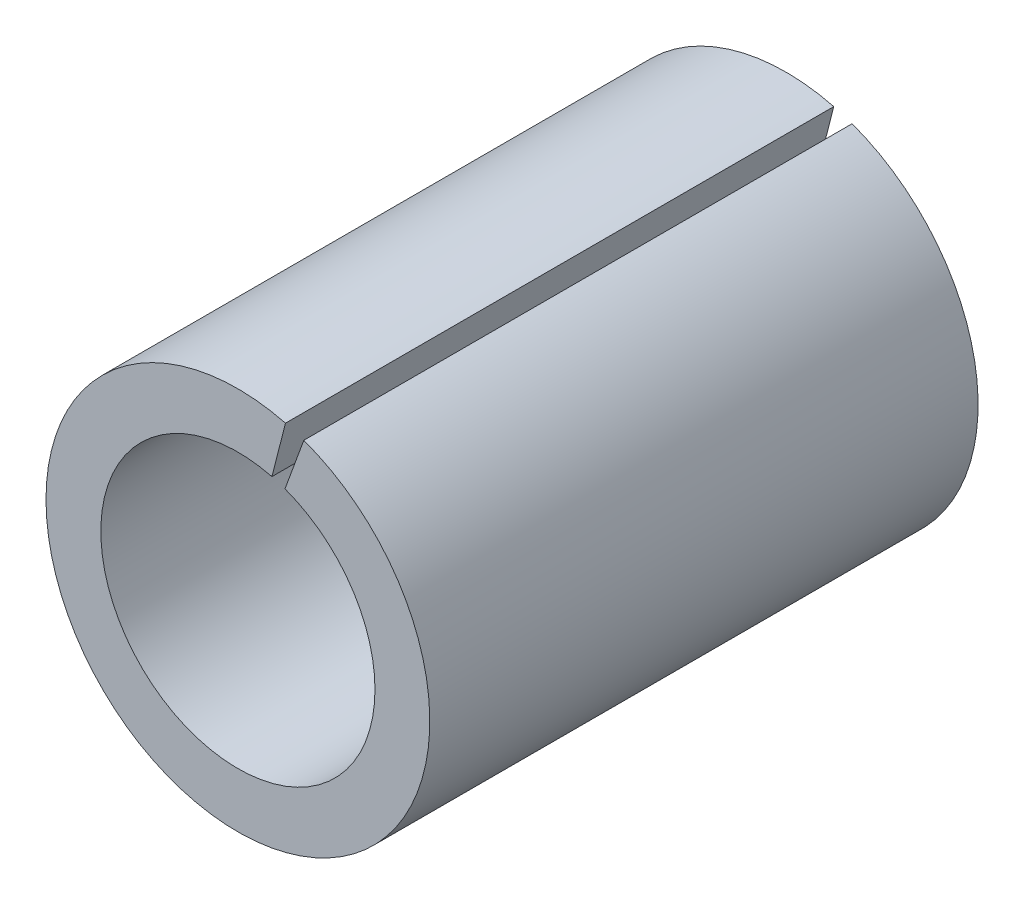
ISO-10303-21;
HEADER;
FILE_DESCRIPTION(('STEP AP214'),'2;1');
FILE_NAME('part.step','',(''),(''),'','','');
FILE_SCHEMA(('AUTOMOTIVE_DESIGN { 1 0 10303 214 1 1 1 1 }'));
ENDSEC;
DATA;
#1=APPLICATION_CONTEXT('core data for automotive mechanical design processes');
#2=APPLICATION_PROTOCOL_DEFINITION('international standard','automotive_design',2000,#1);
#3=PRODUCT_CONTEXT('',#1,'mechanical');
#4=PRODUCT('Part','Part','',(#3));
#5=PRODUCT_RELATED_PRODUCT_CATEGORY('part','',(#4));
#6=PRODUCT_DEFINITION_FORMATION('','',#4);
#7=PRODUCT_DEFINITION_CONTEXT('part definition',#1,'design');
#8=PRODUCT_DEFINITION('design','',#6,#7);
#9=PRODUCT_DEFINITION_SHAPE('','',#8);
#10=(LENGTH_UNIT() NAMED_UNIT(*) SI_UNIT(.MILLI.,.METRE.));
#11=(NAMED_UNIT(*) PLANE_ANGLE_UNIT() SI_UNIT($,.RADIAN.));
#12=(NAMED_UNIT(*) SI_UNIT($,.STERADIAN.) SOLID_ANGLE_UNIT());
#13=UNCERTAINTY_MEASURE_WITH_UNIT(LENGTH_MEASURE(1.E-05),#10,'distance_accuracy_value','');
#14=(GEOMETRIC_REPRESENTATION_CONTEXT(3) GLOBAL_UNCERTAINTY_ASSIGNED_CONTEXT((#13)) GLOBAL_UNIT_ASSIGNED_CONTEXT((#10,
#11,#12)) REPRESENTATION_CONTEXT('',''));
#15=CARTESIAN_POINT('',(0.,0.,0.));
#16=DIRECTION('',(0.,0.,1.));
#17=DIRECTION('',(1.,0.,0.));
#18=AXIS2_PLACEMENT_3D('',#15,#16,#17);
#19=CARTESIAN_POINT('',(0.,0.,10.));
#20=DIRECTION('',(0.,0.,1.));
#21=DIRECTION('',(1.,0.,0.));
#22=AXIS2_PLACEMENT_3D('',#19,#20,#21);
#23=PLANE('',#22);
#24=DIRECTION('',(0.343504443632542,0.939151051324917,0.));
#25=VECTOR('',#24,1.);
#26=CARTESIAN_POINT('',(1.70817035910886,4.67018700437904,10.));
#27=LINE('',#26,#25);
#28=CARTESIAN_POINT('',(0.858761109081354,2.34787762831229,10.));
#29=VERTEX_POINT('',#28);
#30=CARTESIAN_POINT('',(1.2022655527139,3.28702867963721,10.));
#31=VERTEX_POINT('',#30);
#32=EDGE_CURVE('E74',#29,#31,#27,.T.);
#33=ORIENTED_EDGE('',*,*,#32,.F.);
#34=CARTESIAN_POINT('',(0.,0.,10.));
#35=DIRECTION('',(0.,0.,1.));
#36=DIRECTION('',(1.,0.,0.));
#37=AXIS2_PLACEMENT_3D('',#34,#35,#36);
#38=CIRCLE('',#37,2.5);
#39=CARTESIAN_POINT('',(0.620042865626918,2.42188910662424,10.));
#40=VERTEX_POINT('',#39);
#41=EDGE_CURVE('E83',#40,#29,#38,.T.);
#42=ORIENTED_EDGE('',*,*,#41,.F.);
#43=DIRECTION('',(-0.248017146250767,-0.968755642649696,0.));
#44=VECTOR('',#43,1.);
#45=CARTESIAN_POINT('',(0.,0.,10.));
#46=LINE('',#45,#44);
#47=CARTESIAN_POINT('',(0.868060011877686,3.39064474927394,10.));
#48=VERTEX_POINT('',#47);
#49=EDGE_CURVE('E57',#48,#40,#46,.T.);
#50=ORIENTED_EDGE('',*,*,#49,.F.);
#51=CARTESIAN_POINT('',(0.,0.,10.));
#52=DIRECTION('',(0.,0.,1.));
#53=DIRECTION('',(1.,0.,0.));
#54=AXIS2_PLACEMENT_3D('',#51,#52,#53);
#55=CIRCLE('',#54,3.5);
#56=EDGE_CURVE('E85',#48,#31,#55,.T.);
#57=ORIENTED_EDGE('',*,*,#56,.T.);
#58=EDGE_LOOP('',(#33,#42,#50,#57));
#59=FACE_BOUND('',#58,.T.);
#60=ADVANCED_FACE('F35',(#59),#23,.T.);
#61=CARTESIAN_POINT('',(0.,0.,0.));
#62=DIRECTION('',(0.,0.,1.));
#63=DIRECTION('',(1.,0.,0.));
#64=AXIS2_PLACEMENT_3D('',#61,#62,#63);
#65=PLANE('',#64);
#66=CARTESIAN_POINT('',(0.,0.,0.));
#67=DIRECTION('',(0.,0.,1.));
#68=DIRECTION('',(1.,0.,0.));
#69=AXIS2_PLACEMENT_3D('',#66,#67,#68);
#70=CIRCLE('',#69,2.5);
#71=CARTESIAN_POINT('',(0.620042865626918,2.42188910662424,0.));
#72=VERTEX_POINT('',#71);
#73=CARTESIAN_POINT('',(0.858761109081354,2.34787762831229,0.));
#74=VERTEX_POINT('',#73);
#75=EDGE_CURVE('E89',#72,#74,#70,.T.);
#76=ORIENTED_EDGE('',*,*,#75,.T.);
#77=DIRECTION('',(0.343504443632542,0.939151051324918,0.));
#78=VECTOR('',#77,1.);
#79=CARTESIAN_POINT('',(0.,0.,0.));
#80=LINE('',#79,#78);
#81=CARTESIAN_POINT('',(1.2022655527139,3.28702867963721,0.));
#82=VERTEX_POINT('',#81);
#83=EDGE_CURVE('E49',#74,#82,#80,.T.);
#84=ORIENTED_EDGE('',*,*,#83,.T.);
#85=CARTESIAN_POINT('',(0.,0.,0.));
#86=DIRECTION('',(0.,0.,1.));
#87=DIRECTION('',(1.,0.,0.));
#88=AXIS2_PLACEMENT_3D('',#85,#86,#87);
#89=CIRCLE('',#88,3.5);
#90=CARTESIAN_POINT('',(0.868060011877686,3.39064474927394,0.));
#91=VERTEX_POINT('',#90);
#92=EDGE_CURVE('E88',#91,#82,#89,.T.);
#93=ORIENTED_EDGE('',*,*,#92,.F.);
#94=DIRECTION('',(-0.248017146250767,-0.968755642649696,0.));
#95=VECTOR('',#94,1.);
#96=CARTESIAN_POINT('',(0.,0.,0.));
#97=LINE('',#96,#95);
#98=EDGE_CURVE('E100',#91,#72,#97,.T.);
#99=ORIENTED_EDGE('',*,*,#98,.T.);
#100=EDGE_LOOP('',(#76,#84,#93,#99));
#101=FACE_BOUND('',#100,.T.);
#102=ADVANCED_FACE('F104',(#101),#65,.F.);
#103=CARTESIAN_POINT('',(0.,0.,10.));
#104=DIRECTION('',(0.,0.,-1.));
#105=DIRECTION('',(-1.,0.,0.));
#106=AXIS2_PLACEMENT_3D('',#103,#104,#105);
#107=CYLINDRICAL_SURFACE('',#106,3.5);
#108=ORIENTED_EDGE('',*,*,#92,.T.);
#109=DIRECTION('',(0.,0.,-1.));
#110=VECTOR('',#109,1.);
#111=CARTESIAN_POINT('',(1.2022655527139,3.28702867963721,10.));
#112=LINE('',#111,#110);
#113=EDGE_CURVE('E93',#82,#31,#112,.F.);
#114=ORIENTED_EDGE('',*,*,#113,.T.);
#115=ORIENTED_EDGE('',*,*,#56,.F.);
#116=DIRECTION('',(0.,0.,-1.));
#117=VECTOR('',#116,1.);
#118=CARTESIAN_POINT('',(0.868060011877686,3.39064474927394,10.));
#119=LINE('',#118,#117);
#120=EDGE_CURVE('E105',#48,#91,#119,.T.);
#121=ORIENTED_EDGE('',*,*,#120,.T.);
#122=EDGE_LOOP('',(#108,#114,#115,#121));
#123=FACE_BOUND('',#122,.T.);
#124=ADVANCED_FACE('F37',(#123),#107,.T.);
#125=CARTESIAN_POINT('',(0.,0.,10.));
#126=DIRECTION('',(0.,0.,-1.));
#127=DIRECTION('',(-1.,0.,0.));
#128=AXIS2_PLACEMENT_3D('',#125,#126,#127);
#129=CYLINDRICAL_SURFACE('',#128,2.5);
#130=DIRECTION('',(0.,0.,-1.));
#131=VECTOR('',#130,1.);
#132=CARTESIAN_POINT('',(0.858761109081354,2.34787762831229,10.));
#133=LINE('',#132,#131);
#134=EDGE_CURVE('E11',#74,#29,#133,.F.);
#135=ORIENTED_EDGE('',*,*,#134,.F.);
#136=ORIENTED_EDGE('',*,*,#75,.F.);
#137=DIRECTION('',(0.,0.,-1.));
#138=VECTOR('',#137,1.);
#139=CARTESIAN_POINT('',(0.620042865626918,2.42188910662424,10.));
#140=LINE('',#139,#138);
#141=EDGE_CURVE('E43',#40,#72,#140,.T.);
#142=ORIENTED_EDGE('',*,*,#141,.F.);
#143=ORIENTED_EDGE('',*,*,#41,.T.);
#144=EDGE_LOOP('',(#135,#136,#142,#143));
#145=FACE_BOUND('',#144,.T.);
#146=ADVANCED_FACE('F87',(#145),#129,.F.);
#147=CARTESIAN_POINT('',(0.,0.,-90.));
#148=DIRECTION('',(-0.968755642649696,0.248017146250767,0.));
#149=DIRECTION('',(-0.248017146250767,-0.968755642649696,0.));
#150=AXIS2_PLACEMENT_3D('',#147,#148,#149);
#151=PLANE('',#150);
#152=ORIENTED_EDGE('',*,*,#49,.T.);
#153=ORIENTED_EDGE('',*,*,#141,.T.);
#154=ORIENTED_EDGE('',*,*,#98,.F.);
#155=ORIENTED_EDGE('',*,*,#120,.F.);
#156=EDGE_LOOP('',(#152,#153,#154,#155));
#157=FACE_BOUND('',#156,.T.);
#158=ADVANCED_FACE('F99',(#157),#151,.F.);
#159=CARTESIAN_POINT('',(1.70817035910886,4.67018700437904,-90.));
#160=DIRECTION('',(0.939151051324917,-0.343504443632542,0.));
#161=DIRECTION('',(0.343504443632542,0.939151051324918,0.));
#162=AXIS2_PLACEMENT_3D('',#159,#160,#161);
#163=PLANE('',#162);
#164=ORIENTED_EDGE('',*,*,#83,.F.);
#165=ORIENTED_EDGE('',*,*,#134,.T.);
#166=ORIENTED_EDGE('',*,*,#32,.T.);
#167=ORIENTED_EDGE('',*,*,#113,.F.);
#168=EDGE_LOOP('',(#164,#165,#166,#167));
#169=FACE_BOUND('',#168,.T.);
#170=ADVANCED_FACE('F73',(#169),#163,.F.);
#171=CLOSED_SHELL('',(#60,#102,#124,#146,#158,#170));
#172=MANIFOLD_SOLID_BREP('B2',#171);
#173=ADVANCED_BREP_SHAPE_REPRESENTATION('',(#18,#172),#14);
#174=SHAPE_DEFINITION_REPRESENTATION(#9,#173);
ENDSEC;
END-ISO-10303-21;
